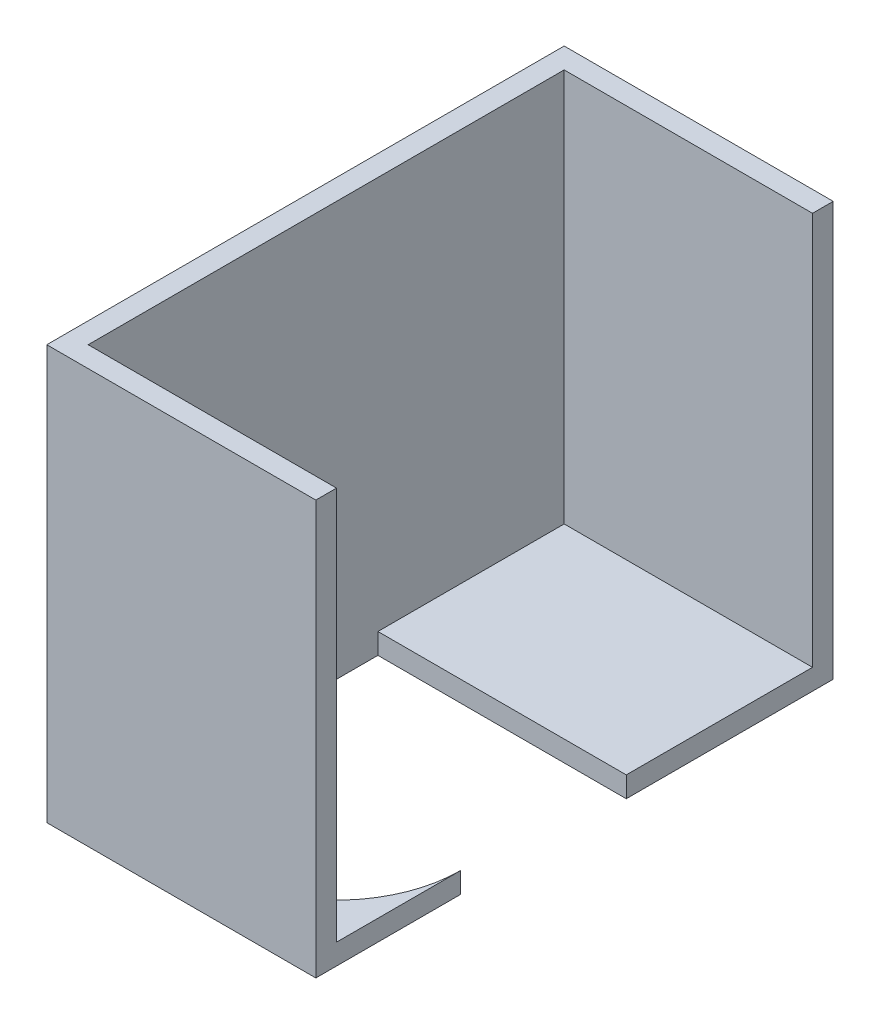
ISO-10303-21;
HEADER;
FILE_DESCRIPTION(('STEP AP214'),'2;1');
FILE_NAME('part.step','',(''),(''),'','','');
FILE_SCHEMA(('AUTOMOTIVE_DESIGN { 1 0 10303 214 1 1 1 1 }'));
ENDSEC;
DATA;
#1=APPLICATION_CONTEXT('core data for automotive mechanical design processes');
#2=APPLICATION_PROTOCOL_DEFINITION('international standard','automotive_design',2000,#1);
#3=PRODUCT_CONTEXT('',#1,'mechanical');
#4=PRODUCT('Part','Part','',(#3));
#5=PRODUCT_RELATED_PRODUCT_CATEGORY('part','',(#4));
#6=PRODUCT_DEFINITION_FORMATION('','',#4);
#7=PRODUCT_DEFINITION_CONTEXT('part definition',#1,'design');
#8=PRODUCT_DEFINITION('design','',#6,#7);
#9=PRODUCT_DEFINITION_SHAPE('','',#8);
#10=(LENGTH_UNIT() NAMED_UNIT(*) SI_UNIT(.MILLI.,.METRE.));
#11=(NAMED_UNIT(*) PLANE_ANGLE_UNIT() SI_UNIT($,.RADIAN.));
#12=(NAMED_UNIT(*) SI_UNIT($,.STERADIAN.) SOLID_ANGLE_UNIT());
#13=UNCERTAINTY_MEASURE_WITH_UNIT(LENGTH_MEASURE(1.E-05),#10,'distance_accuracy_value','');
#14=(GEOMETRIC_REPRESENTATION_CONTEXT(3) GLOBAL_UNCERTAINTY_ASSIGNED_CONTEXT((#13)) GLOBAL_UNIT_ASSIGNED_CONTEXT((#10,
#11,#12)) REPRESENTATION_CONTEXT('',''));
#15=CARTESIAN_POINT('',(0.,0.,0.));
#16=DIRECTION('',(0.,0.,1.));
#17=DIRECTION('',(1.,0.,0.));
#18=AXIS2_PLACEMENT_3D('',#15,#16,#17);
#19=CARTESIAN_POINT('',(7.,20.,12.5));
#20=DIRECTION('',(-1.,0.,0.));
#21=DIRECTION('',(0.,0.,1.));
#22=AXIS2_PLACEMENT_3D('',#19,#20,#21);
#23=PLANE('',#22);
#24=DIRECTION('',(0.,-1.,0.));
#25=VECTOR('',#24,1.);
#26=CARTESIAN_POINT('',(7.,20.,-2.49999999999999));
#27=LINE('',#26,#25);
#28=CARTESIAN_POINT('',(7.,1.,-2.49999999999999));
#29=VERTEX_POINT('',#28);
#30=CARTESIAN_POINT('',(7.,0.,-2.49999999999999));
#31=VERTEX_POINT('',#30);
#32=EDGE_CURVE('E48',#29,#31,#27,.T.);
#33=ORIENTED_EDGE('',*,*,#32,.T.);
#34=DIRECTION('',(0.,0.,-1.));
#35=VECTOR('',#34,1.);
#36=CARTESIAN_POINT('',(7.,0.,12.5));
#37=LINE('',#36,#35);
#38=CARTESIAN_POINT('',(7.,0.,-12.5));
#39=VERTEX_POINT('',#38);
#40=EDGE_CURVE('E184',#31,#39,#37,.T.);
#41=ORIENTED_EDGE('',*,*,#40,.T.);
#42=DIRECTION('',(0.,-1.,0.));
#43=VECTOR('',#42,1.);
#44=CARTESIAN_POINT('',(7.,20.,-12.5));
#45=LINE('',#44,#43);
#46=CARTESIAN_POINT('',(7.,20.,-12.5));
#47=VERTEX_POINT('',#46);
#48=EDGE_CURVE('E212',#47,#39,#45,.T.);
#49=ORIENTED_EDGE('',*,*,#48,.F.);
#50=DIRECTION('',(0.,0.,-1.));
#51=VECTOR('',#50,1.);
#52=CARTESIAN_POINT('',(7.,20.,12.5));
#53=LINE('',#52,#51);
#54=CARTESIAN_POINT('',(7.,20.,-11.5));
#55=VERTEX_POINT('',#54);
#56=EDGE_CURVE('E189',#55,#47,#53,.T.);
#57=ORIENTED_EDGE('',*,*,#56,.F.);
#58=DIRECTION('',(0.,-1.,0.));
#59=VECTOR('',#58,1.);
#60=CARTESIAN_POINT('',(7.,20.,-11.5));
#61=LINE('',#60,#59);
#62=CARTESIAN_POINT('',(7.,1.,-11.5));
#63=VERTEX_POINT('',#62);
#64=EDGE_CURVE('E56',#55,#63,#61,.T.);
#65=ORIENTED_EDGE('',*,*,#64,.T.);
#66=DIRECTION('',(0.,0.,-1.));
#67=VECTOR('',#66,1.);
#68=CARTESIAN_POINT('',(7.,1.,-11.5));
#69=LINE('',#68,#67);
#70=EDGE_CURVE('E171',#29,#63,#69,.T.);
#71=ORIENTED_EDGE('',*,*,#70,.F.);
#72=EDGE_LOOP('',(#33,#41,#49,#57,#65,#71));
#73=FACE_BOUND('',#72,.T.);
#74=ADVANCED_FACE('F33',(#73),#23,.F.);
#75=CARTESIAN_POINT('',(0.,0.,0.));
#76=DIRECTION('',(0.,-1.,0.));
#77=DIRECTION('',(0.,0.,-1.));
#78=AXIS2_PLACEMENT_3D('',#75,#76,#77);
#79=PLANE('',#78);
#80=DIRECTION('',(0.,0.,1.));
#81=VECTOR('',#80,1.);
#82=CARTESIAN_POINT('',(-5.,0.,-2.49999999999999));
#83=LINE('',#82,#81);
#84=CARTESIAN_POINT('',(-5.,0.,-2.49999999999999));
#85=VERTEX_POINT('',#84);
#86=CARTESIAN_POINT('',(-5.,0.,5.50000000000001));
#87=VERTEX_POINT('',#86);
#88=EDGE_CURVE('E131',#85,#87,#83,.T.);
#89=ORIENTED_EDGE('',*,*,#88,.T.);
#90=CARTESIAN_POINT('',(1.,0.,5.50000000000001));
#91=DIRECTION('',(0.,1.,0.));
#92=DIRECTION('',(0.,0.,1.));
#93=AXIS2_PLACEMENT_3D('',#90,#91,#92);
#94=CIRCLE('',#93,6.);
#95=CARTESIAN_POINT('',(7.,0.,5.50000000000001));
#96=VERTEX_POINT('',#95);
#97=EDGE_CURVE('E139',#87,#96,#94,.T.);
#98=ORIENTED_EDGE('',*,*,#97,.T.);
#99=CARTESIAN_POINT('',(7.,0.,12.5));
#100=VERTEX_POINT('',#99);
#101=EDGE_CURVE('E196',#100,#96,#37,.T.);
#102=ORIENTED_EDGE('',*,*,#101,.F.);
#103=DIRECTION('',(1.,0.,0.));
#104=VECTOR('',#103,1.);
#105=CARTESIAN_POINT('',(-6.,0.,12.5));
#106=LINE('',#105,#104);
#107=CARTESIAN_POINT('',(-6.,0.,12.5));
#108=VERTEX_POINT('',#107);
#109=EDGE_CURVE('E202',#108,#100,#106,.T.);
#110=ORIENTED_EDGE('',*,*,#109,.F.);
#111=DIRECTION('',(0.,0.,1.));
#112=VECTOR('',#111,1.);
#113=CARTESIAN_POINT('',(-6.,0.,12.5));
#114=LINE('',#113,#112);
#115=CARTESIAN_POINT('',(-6.,0.,-12.5));
#116=VERTEX_POINT('',#115);
#117=EDGE_CURVE('E200',#116,#108,#114,.T.);
#118=ORIENTED_EDGE('',*,*,#117,.F.);
#119=DIRECTION('',(-1.,0.,0.));
#120=VECTOR('',#119,1.);
#121=CARTESIAN_POINT('',(-6.,0.,-12.5));
#122=LINE('',#121,#120);
#123=EDGE_CURVE('E198',#39,#116,#122,.T.);
#124=ORIENTED_EDGE('',*,*,#123,.F.);
#125=ORIENTED_EDGE('',*,*,#40,.F.);
#126=DIRECTION('',(-1.,0.,0.));
#127=VECTOR('',#126,1.);
#128=CARTESIAN_POINT('',(-5.,0.,-2.49999999999999));
#129=LINE('',#128,#127);
#130=EDGE_CURVE('E145',#31,#85,#129,.T.);
#131=ORIENTED_EDGE('',*,*,#130,.T.);
#132=EDGE_LOOP('',(#89,#98,#102,#110,#118,#124,#125,#131));
#133=FACE_BOUND('',#132,.T.);
#134=ADVANCED_FACE('F147',(#133),#79,.T.);
#135=CARTESIAN_POINT('',(0.,1.,0.));
#136=DIRECTION('',(0.,1.,0.));
#137=DIRECTION('',(0.,0.,1.));
#138=AXIS2_PLACEMENT_3D('',#135,#136,#137);
#139=PLANE('',#138);
#140=DIRECTION('',(1.,0.,0.));
#141=VECTOR('',#140,1.);
#142=CARTESIAN_POINT('',(-4.99999999999999,1.,11.5));
#143=LINE('',#142,#141);
#144=CARTESIAN_POINT('',(-4.99999999999999,1.,11.5));
#145=VERTEX_POINT('',#144);
#146=CARTESIAN_POINT('',(1.,1.,11.5));
#147=VERTEX_POINT('',#146);
#148=EDGE_CURVE('E168',#145,#147,#143,.T.);
#149=ORIENTED_EDGE('',*,*,#148,.T.);
#150=CARTESIAN_POINT('',(1.,1.,5.50000000000001));
#151=DIRECTION('',(0.,1.,0.));
#152=DIRECTION('',(0.,0.,1.));
#153=AXIS2_PLACEMENT_3D('',#150,#151,#152);
#154=CIRCLE('',#153,6.);
#155=CARTESIAN_POINT('',(-5.,1.,5.50000000000001));
#156=VERTEX_POINT('',#155);
#157=EDGE_CURVE('E11',#147,#156,#154,.F.);
#158=ORIENTED_EDGE('',*,*,#157,.T.);
#159=DIRECTION('',(0.,0.,1.));
#160=VECTOR('',#159,1.);
#161=CARTESIAN_POINT('',(-5.,1.,-11.5));
#162=LINE('',#161,#160);
#163=EDGE_CURVE('E134',#156,#145,#162,.T.);
#164=ORIENTED_EDGE('',*,*,#163,.T.);
#165=EDGE_LOOP('',(#149,#158,#164));
#166=FACE_BOUND('',#165,.T.);
#167=ADVANCED_FACE('F228',(#166),#139,.T.);
#168=CARTESIAN_POINT('',(7.00000000000001,1.,11.5));
#169=VERTEX_POINT('',#168);
#170=CARTESIAN_POINT('',(7.,1.,5.50000000000001));
#171=VERTEX_POINT('',#170);
#172=EDGE_CURVE('E172',#169,#171,#69,.T.);
#173=ORIENTED_EDGE('',*,*,#172,.T.);
#174=EDGE_CURVE('E37',#171,#147,#154,.F.);
#175=ORIENTED_EDGE('',*,*,#174,.T.);
#176=EDGE_CURVE('E167',#147,#169,#143,.T.);
#177=ORIENTED_EDGE('',*,*,#176,.T.);
#178=EDGE_LOOP('',(#173,#175,#177));
#179=FACE_BOUND('',#178,.T.);
#180=ADVANCED_FACE('F220',(#179),#139,.T.);
#181=CARTESIAN_POINT('',(-5.,1.,-11.5));
#182=VERTEX_POINT('',#181);
#183=CARTESIAN_POINT('',(-5.,1.,-2.49999999999999));
#184=VERTEX_POINT('',#183);
#185=EDGE_CURVE('E164',#182,#184,#162,.T.);
#186=ORIENTED_EDGE('',*,*,#185,.T.);
#187=DIRECTION('',(1.,0.,0.));
#188=VECTOR('',#187,1.);
#189=CARTESIAN_POINT('',(0.,1.,-2.49999999999999));
#190=LINE('',#189,#188);
#191=EDGE_CURVE('E214',#184,#29,#190,.T.);
#192=ORIENTED_EDGE('',*,*,#191,.T.);
#193=ORIENTED_EDGE('',*,*,#70,.T.);
#194=DIRECTION('',(-1.,0.,0.));
#195=VECTOR('',#194,1.);
#196=CARTESIAN_POINT('',(-5.,1.,-11.5));
#197=LINE('',#196,#195);
#198=EDGE_CURVE('E159',#63,#182,#197,.T.);
#199=ORIENTED_EDGE('',*,*,#198,.T.);
#200=EDGE_LOOP('',(#186,#192,#193,#199));
#201=FACE_BOUND('',#200,.T.);
#202=ADVANCED_FACE('F231',(#201),#139,.T.);
#203=ORIENTED_EDGE('',*,*,#101,.T.);
#204=DIRECTION('',(0.,-1.,0.));
#205=VECTOR('',#204,1.);
#206=CARTESIAN_POINT('',(7.,20.,5.50000000000001));
#207=LINE('',#206,#205);
#208=EDGE_CURVE('E136',#171,#96,#207,.T.);
#209=ORIENTED_EDGE('',*,*,#208,.F.);
#210=ORIENTED_EDGE('',*,*,#172,.F.);
#211=DIRECTION('',(0.,-1.,0.));
#212=VECTOR('',#211,1.);
#213=CARTESIAN_POINT('',(7.00000000000001,20.,11.5));
#214=LINE('',#213,#212);
#215=CARTESIAN_POINT('',(7.00000000000001,20.,11.5));
#216=VERTEX_POINT('',#215);
#217=EDGE_CURVE('E179',#216,#169,#214,.T.);
#218=ORIENTED_EDGE('',*,*,#217,.F.);
#219=CARTESIAN_POINT('',(7.,20.,12.5));
#220=VERTEX_POINT('',#219);
#221=EDGE_CURVE('E185',#220,#216,#53,.T.);
#222=ORIENTED_EDGE('',*,*,#221,.F.);
#223=DIRECTION('',(0.,-1.,0.));
#224=VECTOR('',#223,1.);
#225=CARTESIAN_POINT('',(7.,20.,12.5));
#226=LINE('',#225,#224);
#227=EDGE_CURVE('E195',#220,#100,#226,.T.);
#228=ORIENTED_EDGE('',*,*,#227,.T.);
#229=EDGE_LOOP('',(#203,#209,#210,#218,#222,#228));
#230=FACE_BOUND('',#229,.T.);
#231=ADVANCED_FACE('F35',(#230),#23,.F.);
#232=CARTESIAN_POINT('',(0.,20.,0.));
#233=DIRECTION('',(0.,-1.,0.));
#234=DIRECTION('',(0.,0.,-1.));
#235=AXIS2_PLACEMENT_3D('',#232,#233,#234);
#236=PLANE('',#235);
#237=DIRECTION('',(1.,0.,0.));
#238=VECTOR('',#237,1.);
#239=CARTESIAN_POINT('',(-4.99999999999999,20.,11.5));
#240=LINE('',#239,#238);
#241=CARTESIAN_POINT('',(-4.99999999999999,20.,11.5));
#242=VERTEX_POINT('',#241);
#243=EDGE_CURVE('E158',#242,#216,#240,.T.);
#244=ORIENTED_EDGE('',*,*,#243,.F.);
#245=DIRECTION('',(0.,0.,1.));
#246=VECTOR('',#245,1.);
#247=CARTESIAN_POINT('',(-5.,20.,-11.5));
#248=LINE('',#247,#246);
#249=CARTESIAN_POINT('',(-5.,20.,-11.5));
#250=VERTEX_POINT('',#249);
#251=EDGE_CURVE('E156',#250,#242,#248,.T.);
#252=ORIENTED_EDGE('',*,*,#251,.F.);
#253=DIRECTION('',(-1.,0.,0.));
#254=VECTOR('',#253,1.);
#255=CARTESIAN_POINT('',(-5.,20.,-11.5));
#256=LINE('',#255,#254);
#257=EDGE_CURVE('E161',#55,#250,#256,.T.);
#258=ORIENTED_EDGE('',*,*,#257,.F.);
#259=ORIENTED_EDGE('',*,*,#56,.T.);
#260=DIRECTION('',(-1.,0.,0.));
#261=VECTOR('',#260,1.);
#262=CARTESIAN_POINT('',(-6.,20.,-12.5));
#263=LINE('',#262,#261);
#264=CARTESIAN_POINT('',(-6.,20.,-12.5));
#265=VERTEX_POINT('',#264);
#266=EDGE_CURVE('E188',#47,#265,#263,.T.);
#267=ORIENTED_EDGE('',*,*,#266,.T.);
#268=DIRECTION('',(0.,0.,1.));
#269=VECTOR('',#268,1.);
#270=CARTESIAN_POINT('',(-6.,20.,12.5));
#271=LINE('',#270,#269);
#272=CARTESIAN_POINT('',(-6.,20.,12.5));
#273=VERTEX_POINT('',#272);
#274=EDGE_CURVE('E191',#265,#273,#271,.T.);
#275=ORIENTED_EDGE('',*,*,#274,.T.);
#276=DIRECTION('',(1.,0.,0.));
#277=VECTOR('',#276,1.);
#278=CARTESIAN_POINT('',(-6.,20.,12.5));
#279=LINE('',#278,#277);
#280=EDGE_CURVE('E193',#273,#220,#279,.T.);
#281=ORIENTED_EDGE('',*,*,#280,.T.);
#282=ORIENTED_EDGE('',*,*,#221,.T.);
#283=EDGE_LOOP('',(#244,#252,#258,#259,#267,#275,#281,#282));
#284=FACE_BOUND('',#283,.T.);
#285=ADVANCED_FACE('F245',(#284),#236,.F.);
#286=CARTESIAN_POINT('',(-6.,20.,-12.5));
#287=DIRECTION('',(0.,0.,1.));
#288=DIRECTION('',(1.,0.,0.));
#289=AXIS2_PLACEMENT_3D('',#286,#287,#288);
#290=PLANE('',#289);
#291=ORIENTED_EDGE('',*,*,#123,.T.);
#292=DIRECTION('',(0.,-1.,0.));
#293=VECTOR('',#292,1.);
#294=CARTESIAN_POINT('',(-6.,20.,-12.5));
#295=LINE('',#294,#293);
#296=EDGE_CURVE('E209',#265,#116,#295,.T.);
#297=ORIENTED_EDGE('',*,*,#296,.F.);
#298=ORIENTED_EDGE('',*,*,#266,.F.);
#299=ORIENTED_EDGE('',*,*,#48,.T.);
#300=EDGE_LOOP('',(#291,#297,#298,#299));
#301=FACE_BOUND('',#300,.T.);
#302=ADVANCED_FACE('F250',(#301),#290,.F.);
#303=CARTESIAN_POINT('',(-6.,20.,12.5));
#304=DIRECTION('',(1.,0.,0.));
#305=DIRECTION('',(0.,0.,-1.));
#306=AXIS2_PLACEMENT_3D('',#303,#304,#305);
#307=PLANE('',#306);
#308=ORIENTED_EDGE('',*,*,#117,.T.);
#309=DIRECTION('',(0.,-1.,0.));
#310=VECTOR('',#309,1.);
#311=CARTESIAN_POINT('',(-6.,20.,12.5));
#312=LINE('',#311,#310);
#313=EDGE_CURVE('E206',#273,#108,#312,.T.);
#314=ORIENTED_EDGE('',*,*,#313,.F.);
#315=ORIENTED_EDGE('',*,*,#274,.F.);
#316=ORIENTED_EDGE('',*,*,#296,.T.);
#317=EDGE_LOOP('',(#308,#314,#315,#316));
#318=FACE_BOUND('',#317,.T.);
#319=ADVANCED_FACE('F264',(#318),#307,.F.);
#320=CARTESIAN_POINT('',(-6.,20.,12.5));
#321=DIRECTION('',(0.,0.,-1.));
#322=DIRECTION('',(-1.,0.,0.));
#323=AXIS2_PLACEMENT_3D('',#320,#321,#322);
#324=PLANE('',#323);
#325=ORIENTED_EDGE('',*,*,#109,.T.);
#326=ORIENTED_EDGE('',*,*,#227,.F.);
#327=ORIENTED_EDGE('',*,*,#280,.F.);
#328=ORIENTED_EDGE('',*,*,#313,.T.);
#329=EDGE_LOOP('',(#325,#326,#327,#328));
#330=FACE_BOUND('',#329,.T.);
#331=ADVANCED_FACE('F259',(#330),#324,.F.);
#332=CARTESIAN_POINT('',(-5.,20.,-11.5));
#333=DIRECTION('',(1.,0.,0.));
#334=DIRECTION('',(0.,0.,-1.));
#335=AXIS2_PLACEMENT_3D('',#332,#333,#334);
#336=PLANE('',#335);
#337=ORIENTED_EDGE('',*,*,#251,.T.);
#338=DIRECTION('',(0.,-1.,0.));
#339=VECTOR('',#338,1.);
#340=CARTESIAN_POINT('',(-4.99999999999999,20.,11.5));
#341=LINE('',#340,#339);
#342=EDGE_CURVE('E182',#242,#145,#341,.T.);
#343=ORIENTED_EDGE('',*,*,#342,.T.);
#344=ORIENTED_EDGE('',*,*,#163,.F.);
#345=DIRECTION('',(0.,-1.,0.));
#346=VECTOR('',#345,1.);
#347=CARTESIAN_POINT('',(-5.,20.,5.50000000000001));
#348=LINE('',#347,#346);
#349=EDGE_CURVE('E126',#156,#87,#348,.T.);
#350=ORIENTED_EDGE('',*,*,#349,.T.);
#351=ORIENTED_EDGE('',*,*,#88,.F.);
#352=DIRECTION('',(0.,-1.,0.));
#353=VECTOR('',#352,1.);
#354=CARTESIAN_POINT('',(-5.,20.,-2.49999999999999));
#355=LINE('',#354,#353);
#356=EDGE_CURVE('E152',#184,#85,#355,.T.);
#357=ORIENTED_EDGE('',*,*,#356,.F.);
#358=ORIENTED_EDGE('',*,*,#185,.F.);
#359=DIRECTION('',(0.,-1.,0.));
#360=VECTOR('',#359,1.);
#361=CARTESIAN_POINT('',(-5.,20.,-11.5));
#362=LINE('',#361,#360);
#363=EDGE_CURVE('E163',#250,#182,#362,.T.);
#364=ORIENTED_EDGE('',*,*,#363,.F.);
#365=EDGE_LOOP('',(#337,#343,#344,#350,#351,#357,#358,#364));
#366=FACE_BOUND('',#365,.T.);
#367=ADVANCED_FACE('F128',(#366),#336,.T.);
#368=CARTESIAN_POINT('',(-4.99999999999999,20.,11.5));
#369=DIRECTION('',(0.,0.,-1.));
#370=DIRECTION('',(-1.,0.,0.));
#371=AXIS2_PLACEMENT_3D('',#368,#369,#370);
#372=PLANE('',#371);
#373=ORIENTED_EDGE('',*,*,#243,.T.);
#374=ORIENTED_EDGE('',*,*,#217,.T.);
#375=ORIENTED_EDGE('',*,*,#176,.F.);
#376=ORIENTED_EDGE('',*,*,#148,.F.);
#377=ORIENTED_EDGE('',*,*,#342,.F.);
#378=EDGE_LOOP('',(#373,#374,#375,#376,#377));
#379=FACE_BOUND('',#378,.T.);
#380=ADVANCED_FACE('F224',(#379),#372,.T.);
#381=CARTESIAN_POINT('',(-5.,20.,-11.5));
#382=DIRECTION('',(0.,0.,1.));
#383=DIRECTION('',(1.,0.,0.));
#384=AXIS2_PLACEMENT_3D('',#381,#382,#383);
#385=PLANE('',#384);
#386=ORIENTED_EDGE('',*,*,#198,.F.);
#387=ORIENTED_EDGE('',*,*,#64,.F.);
#388=ORIENTED_EDGE('',*,*,#257,.T.);
#389=ORIENTED_EDGE('',*,*,#363,.T.);
#390=EDGE_LOOP('',(#386,#387,#388,#389));
#391=FACE_BOUND('',#390,.T.);
#392=ADVANCED_FACE('F270',(#391),#385,.T.);
#393=CARTESIAN_POINT('',(1.,20.,5.50000000000001));
#394=DIRECTION('',(0.,-1.,0.));
#395=DIRECTION('',(0.,0.,-1.));
#396=AXIS2_PLACEMENT_3D('',#393,#394,#395);
#397=CYLINDRICAL_SURFACE('',#396,6.);
#398=ORIENTED_EDGE('',*,*,#174,.F.);
#399=ORIENTED_EDGE('',*,*,#208,.T.);
#400=ORIENTED_EDGE('',*,*,#97,.F.);
#401=ORIENTED_EDGE('',*,*,#349,.F.);
#402=ORIENTED_EDGE('',*,*,#157,.F.);
#403=EDGE_LOOP('',(#398,#399,#400,#401,#402));
#404=FACE_BOUND('',#403,.T.);
#405=ADVANCED_FACE('F140',(#404),#397,.F.);
#406=CARTESIAN_POINT('',(-5.,20.,-2.49999999999999));
#407=DIRECTION('',(0.,0.,1.));
#408=DIRECTION('',(1.,0.,0.));
#409=AXIS2_PLACEMENT_3D('',#406,#407,#408);
#410=PLANE('',#409);
#411=ORIENTED_EDGE('',*,*,#356,.T.);
#412=ORIENTED_EDGE('',*,*,#130,.F.);
#413=ORIENTED_EDGE('',*,*,#32,.F.);
#414=ORIENTED_EDGE('',*,*,#191,.F.);
#415=EDGE_LOOP('',(#411,#412,#413,#414));
#416=FACE_BOUND('',#415,.T.);
#417=ADVANCED_FACE('F274',(#416),#410,.T.);
#418=CLOSED_SHELL('',(#74,#134,#167,#180,#202,#231,#285,#302,#319,#331,#367,#380,#392,#405,#417));
#419=MANIFOLD_SOLID_BREP('B2',#418);
#420=ADVANCED_BREP_SHAPE_REPRESENTATION('',(#18,#419),#14);
#421=SHAPE_DEFINITION_REPRESENTATION(#9,#420);
ENDSEC;
END-ISO-10303-21;
